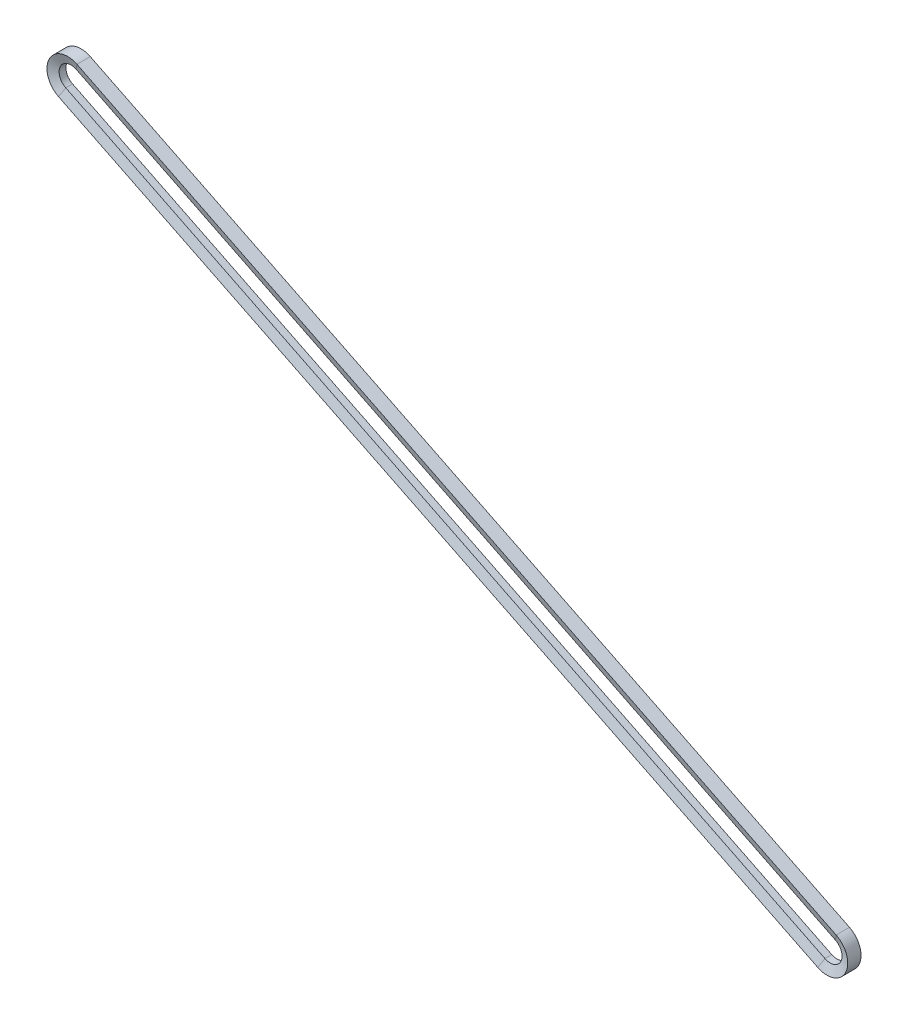
ISO-10303-21;
HEADER;
FILE_DESCRIPTION(('STEP AP214'),'2;1');
FILE_NAME('part.step','',(''),(''),'','','');
FILE_SCHEMA(('AUTOMOTIVE_DESIGN { 1 0 10303 214 1 1 1 1 }'));
ENDSEC;
DATA;
#1=APPLICATION_CONTEXT('core data for automotive mechanical design processes');
#2=APPLICATION_PROTOCOL_DEFINITION('international standard','automotive_design',2000,#1);
#3=PRODUCT_CONTEXT('',#1,'mechanical');
#4=PRODUCT('Part','Part','',(#3));
#5=PRODUCT_RELATED_PRODUCT_CATEGORY('part','',(#4));
#6=PRODUCT_DEFINITION_FORMATION('','',#4);
#7=PRODUCT_DEFINITION_CONTEXT('part definition',#1,'design');
#8=PRODUCT_DEFINITION('design','',#6,#7);
#9=PRODUCT_DEFINITION_SHAPE('','',#8);
#10=(LENGTH_UNIT() NAMED_UNIT(*) SI_UNIT(.MILLI.,.METRE.));
#11=(NAMED_UNIT(*) PLANE_ANGLE_UNIT() SI_UNIT($,.RADIAN.));
#12=(NAMED_UNIT(*) SI_UNIT($,.STERADIAN.) SOLID_ANGLE_UNIT());
#13=UNCERTAINTY_MEASURE_WITH_UNIT(LENGTH_MEASURE(1.E-05),#10,'distance_accuracy_value','');
#14=(GEOMETRIC_REPRESENTATION_CONTEXT(3) GLOBAL_UNCERTAINTY_ASSIGNED_CONTEXT((#13)) GLOBAL_UNIT_ASSIGNED_CONTEXT((#10,
#11,#12)) REPRESENTATION_CONTEXT('',''));
#15=CARTESIAN_POINT('',(0.,0.,0.));
#16=DIRECTION('',(0.,0.,1.));
#17=DIRECTION('',(1.,0.,0.));
#18=AXIS2_PLACEMENT_3D('',#15,#16,#17);
#19=CARTESIAN_POINT('',(342.117807064984,-162.821318820467,1.525));
#20=DIRECTION('',(-0.442324592710984,-0.896855035489606,0.));
#21=DIRECTION('',(0.896855035489606,-0.442324592710984,0.));
#22=AXIS2_PLACEMENT_3D('',#19,#20,#21);
#23=PLANE('',#22);
#24=DIRECTION('',(-0.896855035489606,0.442324592710984,0.));
#25=VECTOR('',#24,1.);
#26=CARTESIAN_POINT('',(342.117807064984,-162.821318820467,-1.525));
#27=LINE('',#26,#25);
#28=CARTESIAN_POINT('',(342.117807064984,-162.821318820467,-1.525));
#29=VERTEX_POINT('',#28);
#30=CARTESIAN_POINT('',(2.34432034136821,4.75333168809491,-1.525));
#31=VERTEX_POINT('',#30);
#32=EDGE_CURVE('E11',#29,#31,#27,.T.);
#33=ORIENTED_EDGE('',*,*,#32,.F.);
#34=DIRECTION('',(0.,0.,-1.));
#35=VECTOR('',#34,1.);
#36=CARTESIAN_POINT('',(342.117807064984,-162.821318820467,1.525));
#37=LINE('',#36,#35);
#38=CARTESIAN_POINT('',(342.117807064984,-162.821318820467,1.525));
#39=VERTEX_POINT('',#38);
#40=EDGE_CURVE('E42',#29,#39,#37,.F.);
#41=ORIENTED_EDGE('',*,*,#40,.T.);
#42=DIRECTION('',(-0.896855035489606,0.442324592710984,0.));
#43=VECTOR('',#42,1.);
#44=CARTESIAN_POINT('',(342.117807064984,-162.821318820467,1.525));
#45=LINE('',#44,#43);
#46=CARTESIAN_POINT('',(2.34432034136821,4.75333168809491,1.525));
#47=VERTEX_POINT('',#46);
#48=EDGE_CURVE('E127',#39,#47,#45,.T.);
#49=ORIENTED_EDGE('',*,*,#48,.T.);
#50=DIRECTION('',(0.,0.,-1.));
#51=VECTOR('',#50,1.);
#52=CARTESIAN_POINT('',(2.34432034136821,4.75333168809491,1.525));
#53=LINE('',#52,#51);
#54=EDGE_CURVE('E130',#31,#47,#53,.F.);
#55=ORIENTED_EDGE('',*,*,#54,.F.);
#56=EDGE_LOOP('',(#33,#41,#49,#55));
#57=FACE_BOUND('',#56,.T.);
#58=ADVANCED_FACE('F39',(#57),#23,.T.);
#59=CARTESIAN_POINT('',(342.117807064984,-162.821318820467,-1.525));
#60=DIRECTION('',(-0.151283920595477,-0.3067424877805,-0.93969262078591));
#61=DIRECTION('',(0.,0.950634084780424,-0.310314093868915));
#62=AXIS2_PLACEMENT_3D('',#59,#60,#61);
#63=PLANE('',#62);
#64=DIRECTION('',(-0.896855035489606,0.442324592710984,0.));
#65=VECTOR('',#64,1.);
#66=CARTESIAN_POINT('',(343.887105435828,-159.233898678508,-2.98088093706479));
#67=LINE('',#66,#65);
#68=CARTESIAN_POINT('',(343.887105435828,-159.233898678508,-2.98088093706479));
#69=VERTEX_POINT('',#68);
#70=CARTESIAN_POINT('',(4.11361871221214,8.34075183005334,-2.98088093706479));
#71=VERTEX_POINT('',#70);
#72=EDGE_CURVE('E47',#69,#71,#67,.T.);
#73=ORIENTED_EDGE('',*,*,#72,.F.);
#74=DIRECTION('',(0.415649155762644,0.842768058764268,-0.342020143325666));
#75=VECTOR('',#74,1.);
#76=CARTESIAN_POINT('',(342.117807064984,-162.821318820467,-1.525));
#77=LINE('',#76,#75);
#78=EDGE_CURVE('E197',#69,#29,#77,.F.);
#79=ORIENTED_EDGE('',*,*,#78,.T.);
#80=ORIENTED_EDGE('',*,*,#32,.T.);
#81=DIRECTION('',(0.415649155762644,0.842768058764268,-0.342020143325666));
#82=VECTOR('',#81,1.);
#83=CARTESIAN_POINT('',(2.34432034136821,4.75333168809491,-1.525));
#84=LINE('',#83,#82);
#85=EDGE_CURVE('E155',#71,#31,#84,.F.);
#86=ORIENTED_EDGE('',*,*,#85,.F.);
#87=EDGE_LOOP('',(#73,#79,#80,#86));
#88=FACE_BOUND('',#87,.T.);
#89=ADVANCED_FACE('F221',(#88),#63,.T.);
#90=CARTESIAN_POINT('',(343.887105435828,-159.233898678508,2.98088093706479));
#91=DIRECTION('',(0.442324592710984,0.896855035489606,0.));
#92=DIRECTION('',(-0.896855035489606,0.442324592710984,0.));
#93=AXIS2_PLACEMENT_3D('',#90,#91,#92);
#94=PLANE('',#93);
#95=DIRECTION('',(-0.896855035489606,0.442324592710984,0.));
#96=VECTOR('',#95,1.);
#97=CARTESIAN_POINT('',(343.887105435828,-159.233898678508,2.98088093706479));
#98=LINE('',#97,#96);
#99=CARTESIAN_POINT('',(343.887105435828,-159.233898678508,2.98088093706479));
#100=VERTEX_POINT('',#99);
#101=CARTESIAN_POINT('',(4.11361871221214,8.34075183005334,2.98088093706479));
#102=VERTEX_POINT('',#101);
#103=EDGE_CURVE('E136',#100,#102,#98,.T.);
#104=ORIENTED_EDGE('',*,*,#103,.F.);
#105=DIRECTION('',(0.,0.,-1.));
#106=VECTOR('',#105,1.);
#107=CARTESIAN_POINT('',(343.887105435828,-159.233898678508,2.98088093706479));
#108=LINE('',#107,#106);
#109=EDGE_CURVE('E181',#100,#69,#108,.T.);
#110=ORIENTED_EDGE('',*,*,#109,.T.);
#111=ORIENTED_EDGE('',*,*,#72,.T.);
#112=DIRECTION('',(0.,0.,-1.));
#113=VECTOR('',#112,1.);
#114=CARTESIAN_POINT('',(4.11361871221214,8.34075183005334,2.98088093706479));
#115=LINE('',#114,#113);
#116=EDGE_CURVE('E159',#102,#71,#115,.T.);
#117=ORIENTED_EDGE('',*,*,#116,.F.);
#118=EDGE_LOOP('',(#104,#110,#111,#117));
#119=FACE_BOUND('',#118,.T.);
#120=ADVANCED_FACE('F226',(#119),#94,.T.);
#121=CARTESIAN_POINT('',(339.773486723616,-167.574650508562,0.));
#122=DIRECTION('',(0.,0.,1.));
#123=DIRECTION('',(1.,0.,0.));
#124=AXIS2_PLACEMENT_3D('',#121,#122,#123);
#125=CYLINDRICAL_SURFACE('',#124,5.3000000000001);
#126=ORIENTED_EDGE('',*,*,#40,.F.);
#127=CARTESIAN_POINT('',(339.773486723616,-167.574650508562,-1.525));
#128=DIRECTION('',(0.,0.,1.));
#129=DIRECTION('',(-0.442324592710977,-0.896855035489609,0.));
#130=AXIS2_PLACEMENT_3D('',#127,#128,#129);
#131=CIRCLE('',#130,5.3000000000001);
#132=CARTESIAN_POINT('',(337.429166382248,-172.327982196657,-1.525));
#133=VERTEX_POINT('',#132);
#134=EDGE_CURVE('E83',#133,#29,#131,.T.);
#135=ORIENTED_EDGE('',*,*,#134,.F.);
#136=DIRECTION('',(0.,0.,-1.));
#137=VECTOR('',#136,1.);
#138=CARTESIAN_POINT('',(337.429166382248,-172.327982196657,1.525));
#139=LINE('',#138,#137);
#140=CARTESIAN_POINT('',(337.429166382248,-172.327982196657,1.525));
#141=VERTEX_POINT('',#140);
#142=EDGE_CURVE('E184',#133,#141,#139,.F.);
#143=ORIENTED_EDGE('',*,*,#142,.T.);
#144=CARTESIAN_POINT('',(339.773486723616,-167.574650508562,1.525));
#145=DIRECTION('',(0.,0.,1.));
#146=DIRECTION('',(-0.442324592710977,-0.896855035489609,0.));
#147=AXIS2_PLACEMENT_3D('',#144,#145,#146);
#148=CIRCLE('',#147,5.3000000000001);
#149=EDGE_CURVE('E179',#141,#39,#148,.T.);
#150=ORIENTED_EDGE('',*,*,#149,.T.);
#151=EDGE_LOOP('',(#126,#135,#143,#150));
#152=FACE_BOUND('',#151,.T.);
#153=ADVANCED_FACE('F210',(#152),#125,.F.);
#154=CARTESIAN_POINT('',(339.773486723616,-167.574650508562,-2.98088093706479));
#155=DIRECTION('',(0.,0.,-1.));
#156=DIRECTION('',(-1.,0.,0.));
#157=AXIS2_PLACEMENT_3D('',#154,#155,#156);
#158=CONICAL_SURFACE('',#157,9.30000000000011,1.22173047639603);
#159=ORIENTED_EDGE('',*,*,#134,.T.);
#160=ORIENTED_EDGE('',*,*,#78,.F.);
#161=CARTESIAN_POINT('',(339.773486723616,-167.574650508562,-2.98088093706479));
#162=DIRECTION('',(0.,0.,1.));
#163=DIRECTION('',(-0.44232459271098,-0.896855035489608,0.));
#164=AXIS2_PLACEMENT_3D('',#161,#162,#163);
#165=CIRCLE('',#164,9.30000000000011);
#166=CARTESIAN_POINT('',(335.659868011404,-175.915402338615,-2.98088093706479));
#167=VERTEX_POINT('',#166);
#168=EDGE_CURVE('E92',#167,#69,#165,.T.);
#169=ORIENTED_EDGE('',*,*,#168,.F.);
#170=DIRECTION('',(-0.415649155762643,-0.842768058764268,-0.342020143325666));
#171=VECTOR('',#170,1.);
#172=CARTESIAN_POINT('',(337.429166382248,-172.327982196657,-1.525));
#173=LINE('',#172,#171);
#174=EDGE_CURVE('E193',#167,#133,#173,.F.);
#175=ORIENTED_EDGE('',*,*,#174,.T.);
#176=EDGE_LOOP('',(#159,#160,#169,#175));
#177=FACE_BOUND('',#176,.T.);
#178=ADVANCED_FACE('F220',(#177),#158,.F.);
#179=CARTESIAN_POINT('',(339.773486723616,-167.574650508562,0.));
#180=DIRECTION('',(0.,0.,1.));
#181=DIRECTION('',(1.,0.,0.));
#182=AXIS2_PLACEMENT_3D('',#179,#180,#181);
#183=CYLINDRICAL_SURFACE('',#182,9.30000000000011);
#184=ORIENTED_EDGE('',*,*,#168,.T.);
#185=ORIENTED_EDGE('',*,*,#109,.F.);
#186=CARTESIAN_POINT('',(339.773486723616,-167.574650508562,2.98088093706479));
#187=DIRECTION('',(0.,0.,1.));
#188=DIRECTION('',(-0.44232459271098,-0.896855035489608,0.));
#189=AXIS2_PLACEMENT_3D('',#186,#187,#188);
#190=CIRCLE('',#189,9.30000000000011);
#191=CARTESIAN_POINT('',(335.659868011404,-175.915402338615,2.98088093706479));
#192=VERTEX_POINT('',#191);
#193=EDGE_CURVE('E100',#192,#100,#190,.T.);
#194=ORIENTED_EDGE('',*,*,#193,.F.);
#195=DIRECTION('',(0.,0.,-1.));
#196=VECTOR('',#195,1.);
#197=CARTESIAN_POINT('',(335.659868011404,-175.915402338615,2.98088093706479));
#198=LINE('',#197,#196);
#199=EDGE_CURVE('E173',#192,#167,#198,.T.);
#200=ORIENTED_EDGE('',*,*,#199,.T.);
#201=EDGE_LOOP('',(#184,#185,#194,#200));
#202=FACE_BOUND('',#201,.T.);
#203=ADVANCED_FACE('F227',(#202),#183,.T.);
#204=CARTESIAN_POINT('',(339.773486723616,-167.574650508562,1.525));
#205=DIRECTION('',(0.,0.,1.));
#206=DIRECTION('',(1.,0.,0.));
#207=AXIS2_PLACEMENT_3D('',#204,#205,#206);
#208=CONICAL_SURFACE('',#207,5.3000000000001,1.22173047639603);
#209=ORIENTED_EDGE('',*,*,#193,.T.);
#210=DIRECTION('',(0.415649155762644,0.842768058764268,0.342020143325666));
#211=VECTOR('',#210,1.);
#212=CARTESIAN_POINT('',(342.117807064984,-162.821318820467,1.525));
#213=LINE('',#212,#211);
#214=EDGE_CURVE('E177',#39,#100,#213,.T.);
#215=ORIENTED_EDGE('',*,*,#214,.F.);
#216=ORIENTED_EDGE('',*,*,#149,.F.);
#217=DIRECTION('',(-0.415649155762643,-0.842768058764268,0.342020143325666));
#218=VECTOR('',#217,1.);
#219=CARTESIAN_POINT('',(337.429166382248,-172.327982196657,1.525));
#220=LINE('',#219,#218);
#221=EDGE_CURVE('E168',#141,#192,#220,.T.);
#222=ORIENTED_EDGE('',*,*,#221,.T.);
#223=EDGE_LOOP('',(#209,#215,#216,#222));
#224=FACE_BOUND('',#223,.T.);
#225=ADVANCED_FACE('F228',(#224),#208,.F.);
#226=CARTESIAN_POINT('',(-2.34432034136821,-4.75333168809492,1.525));
#227=DIRECTION('',(0.442324592710984,0.896855035489606,0.));
#228=DIRECTION('',(-0.896855035489606,0.442324592710984,0.));
#229=AXIS2_PLACEMENT_3D('',#226,#227,#228);
#230=PLANE('',#229);
#231=ORIENTED_EDGE('',*,*,#142,.F.);
#232=DIRECTION('',(0.896855035489606,-0.442324592710984,0.));
#233=VECTOR('',#232,1.);
#234=CARTESIAN_POINT('',(-2.34432034136821,-4.75333168809492,-1.525));
#235=LINE('',#234,#233);
#236=CARTESIAN_POINT('',(-2.3443203413683,-4.75333168809509,-1.525));
#237=VERTEX_POINT('',#236);
#238=EDGE_CURVE('E203',#237,#133,#235,.T.);
#239=ORIENTED_EDGE('',*,*,#238,.F.);
#240=DIRECTION('',(0.,0.,-1.));
#241=VECTOR('',#240,1.);
#242=CARTESIAN_POINT('',(-2.34432034136821,-4.75333168809491,1.525));
#243=LINE('',#242,#241);
#244=CARTESIAN_POINT('',(-2.3443203413683,-4.75333168809509,1.525));
#245=VERTEX_POINT('',#244);
#246=EDGE_CURVE('E176',#237,#245,#243,.F.);
#247=ORIENTED_EDGE('',*,*,#246,.T.);
#248=DIRECTION('',(0.896855035489606,-0.442324592710984,0.));
#249=VECTOR('',#248,1.);
#250=CARTESIAN_POINT('',(-2.34432034136821,-4.75333168809492,1.525));
#251=LINE('',#250,#249);
#252=EDGE_CURVE('E171',#245,#141,#251,.T.);
#253=ORIENTED_EDGE('',*,*,#252,.T.);
#254=EDGE_LOOP('',(#231,#239,#247,#253));
#255=FACE_BOUND('',#254,.T.);
#256=ADVANCED_FACE('F215',(#255),#230,.T.);
#257=CARTESIAN_POINT('',(-2.34432034136821,-4.75333168809492,-1.525));
#258=DIRECTION('',(0.151283920595477,0.3067424877805,-0.93969262078591));
#259=DIRECTION('',(0.,0.950634084780424,0.310314093868915));
#260=AXIS2_PLACEMENT_3D('',#257,#258,#259);
#261=PLANE('',#260);
#262=ORIENTED_EDGE('',*,*,#238,.T.);
#263=ORIENTED_EDGE('',*,*,#174,.F.);
#264=DIRECTION('',(0.896855035489606,-0.442324592710984,0.));
#265=VECTOR('',#264,1.);
#266=CARTESIAN_POINT('',(-4.11361871221214,-8.34075183005334,-2.98088093706479));
#267=LINE('',#266,#265);
#268=CARTESIAN_POINT('',(-4.11361871221223,-8.34075183005352,-2.98088093706479));
#269=VERTEX_POINT('',#268);
#270=EDGE_CURVE('E112',#269,#167,#267,.T.);
#271=ORIENTED_EDGE('',*,*,#270,.F.);
#272=DIRECTION('',(-0.415649155762643,-0.842768058764268,-0.342020143325666));
#273=VECTOR('',#272,1.);
#274=CARTESIAN_POINT('',(-2.34432034136821,-4.75333168809491,-1.525));
#275=LINE('',#274,#273);
#276=EDGE_CURVE('E190',#269,#237,#275,.F.);
#277=ORIENTED_EDGE('',*,*,#276,.T.);
#278=EDGE_LOOP('',(#262,#263,#271,#277));
#279=FACE_BOUND('',#278,.T.);
#280=ADVANCED_FACE('F219',(#279),#261,.T.);
#281=CARTESIAN_POINT('',(-4.11361871221214,-8.34075183005334,2.98088093706479));
#282=DIRECTION('',(-0.442324592710984,-0.896855035489606,0.));
#283=DIRECTION('',(0.896855035489606,-0.442324592710984,0.));
#284=AXIS2_PLACEMENT_3D('',#281,#282,#283);
#285=PLANE('',#284);
#286=ORIENTED_EDGE('',*,*,#270,.T.);
#287=ORIENTED_EDGE('',*,*,#199,.F.);
#288=DIRECTION('',(0.896855035489606,-0.442324592710984,0.));
#289=VECTOR('',#288,1.);
#290=CARTESIAN_POINT('',(-4.11361871221214,-8.34075183005334,2.98088093706479));
#291=LINE('',#290,#289);
#292=CARTESIAN_POINT('',(-4.11361871221223,-8.34075183005352,2.98088093706479));
#293=VERTEX_POINT('',#292);
#294=EDGE_CURVE('E118',#293,#192,#291,.T.);
#295=ORIENTED_EDGE('',*,*,#294,.F.);
#296=DIRECTION('',(0.,0.,-1.));
#297=VECTOR('',#296,1.);
#298=CARTESIAN_POINT('',(-4.11361871221214,-8.34075183005334,2.98088093706479));
#299=LINE('',#298,#297);
#300=EDGE_CURVE('E166',#293,#269,#299,.T.);
#301=ORIENTED_EDGE('',*,*,#300,.T.);
#302=EDGE_LOOP('',(#286,#287,#295,#301));
#303=FACE_BOUND('',#302,.T.);
#304=ADVANCED_FACE('F284',(#303),#285,.T.);
#305=CARTESIAN_POINT('',(-2.34432034136821,-4.75333168809492,1.525));
#306=DIRECTION('',(0.151283920595477,0.3067424877805,0.93969262078591));
#307=DIRECTION('',(0.,-0.950634084780424,0.310314093868915));
#308=AXIS2_PLACEMENT_3D('',#305,#306,#307);
#309=PLANE('',#308);
#310=ORIENTED_EDGE('',*,*,#294,.T.);
#311=ORIENTED_EDGE('',*,*,#221,.F.);
#312=ORIENTED_EDGE('',*,*,#252,.F.);
#313=DIRECTION('',(-0.415649155762643,-0.842768058764268,0.342020143325666));
#314=VECTOR('',#313,1.);
#315=CARTESIAN_POINT('',(-2.34432034136821,-4.75333168809491,1.525));
#316=LINE('',#315,#314);
#317=EDGE_CURVE('E147',#245,#293,#316,.T.);
#318=ORIENTED_EDGE('',*,*,#317,.T.);
#319=EDGE_LOOP('',(#310,#311,#312,#318));
#320=FACE_BOUND('',#319,.T.);
#321=ADVANCED_FACE('F213',(#320),#309,.T.);
#322=CARTESIAN_POINT('',(0.,-1.11022302462516E-13,0.));
#323=DIRECTION('',(0.,0.,1.));
#324=DIRECTION('',(1.,0.,0.));
#325=AXIS2_PLACEMENT_3D('',#322,#323,#324);
#326=CYLINDRICAL_SURFACE('',#325,5.3000000000001);
#327=ORIENTED_EDGE('',*,*,#246,.F.);
#328=CARTESIAN_POINT('',(0.,-1.11022302462516E-13,-1.525));
#329=DIRECTION('',(0.,0.,1.));
#330=DIRECTION('',(0.442324592710975,0.89685503548961,0.));
#331=AXIS2_PLACEMENT_3D('',#328,#329,#330);
#332=CIRCLE('',#331,5.3000000000001);
#333=EDGE_CURVE('E154',#31,#237,#332,.T.);
#334=ORIENTED_EDGE('',*,*,#333,.F.);
#335=ORIENTED_EDGE('',*,*,#54,.T.);
#336=CARTESIAN_POINT('',(0.,-1.11022302462516E-13,1.525));
#337=DIRECTION('',(0.,0.,1.));
#338=DIRECTION('',(0.442324592710975,0.89685503548961,0.));
#339=AXIS2_PLACEMENT_3D('',#336,#337,#338);
#340=CIRCLE('',#339,5.3000000000001);
#341=EDGE_CURVE('E142',#47,#245,#340,.T.);
#342=ORIENTED_EDGE('',*,*,#341,.T.);
#343=EDGE_LOOP('',(#327,#334,#335,#342));
#344=FACE_BOUND('',#343,.T.);
#345=ADVANCED_FACE('F152',(#344),#326,.F.);
#346=CARTESIAN_POINT('',(0.,-1.11022302462516E-13,-2.98088093706479));
#347=DIRECTION('',(0.,0.,-1.));
#348=DIRECTION('',(-1.,0.,0.));
#349=AXIS2_PLACEMENT_3D('',#346,#347,#348);
#350=CONICAL_SURFACE('',#349,9.3000000000001,1.22173047639603);
#351=ORIENTED_EDGE('',*,*,#333,.T.);
#352=ORIENTED_EDGE('',*,*,#276,.F.);
#353=CARTESIAN_POINT('',(0.,-1.11022302462516E-13,-2.98088093706479));
#354=DIRECTION('',(0.,0.,1.));
#355=DIRECTION('',(0.442324592710978,0.896855035489609,0.));
#356=AXIS2_PLACEMENT_3D('',#353,#354,#355);
#357=CIRCLE('',#356,9.3000000000001);
#358=EDGE_CURVE('E187',#71,#269,#357,.T.);
#359=ORIENTED_EDGE('',*,*,#358,.F.);
#360=ORIENTED_EDGE('',*,*,#85,.T.);
#361=EDGE_LOOP('',(#351,#352,#359,#360));
#362=FACE_BOUND('',#361,.T.);
#363=ADVANCED_FACE('F217',(#362),#350,.F.);
#364=CARTESIAN_POINT('',(0.,-1.11022302462516E-13,0.));
#365=DIRECTION('',(0.,0.,1.));
#366=DIRECTION('',(1.,0.,0.));
#367=AXIS2_PLACEMENT_3D('',#364,#365,#366);
#368=CYLINDRICAL_SURFACE('',#367,9.3000000000001);
#369=ORIENTED_EDGE('',*,*,#358,.T.);
#370=ORIENTED_EDGE('',*,*,#300,.F.);
#371=CARTESIAN_POINT('',(0.,-1.11022302462516E-13,2.98088093706479));
#372=DIRECTION('',(0.,0.,1.));
#373=DIRECTION('',(0.442324592710978,0.896855035489609,0.));
#374=AXIS2_PLACEMENT_3D('',#371,#372,#373);
#375=CIRCLE('',#374,9.3000000000001);
#376=EDGE_CURVE('E165',#102,#293,#375,.T.);
#377=ORIENTED_EDGE('',*,*,#376,.F.);
#378=ORIENTED_EDGE('',*,*,#116,.T.);
#379=EDGE_LOOP('',(#369,#370,#377,#378));
#380=FACE_BOUND('',#379,.T.);
#381=ADVANCED_FACE('F224',(#380),#368,.T.);
#382=CARTESIAN_POINT('',(0.,-1.11022302462516E-13,1.525));
#383=DIRECTION('',(0.,0.,1.));
#384=DIRECTION('',(1.,0.,0.));
#385=AXIS2_PLACEMENT_3D('',#382,#383,#384);
#386=CONICAL_SURFACE('',#385,5.3000000000001,1.22173047639603);
#387=ORIENTED_EDGE('',*,*,#376,.T.);
#388=ORIENTED_EDGE('',*,*,#317,.F.);
#389=ORIENTED_EDGE('',*,*,#341,.F.);
#390=DIRECTION('',(0.415649155762644,0.842768058764268,0.342020143325666));
#391=VECTOR('',#390,1.);
#392=CARTESIAN_POINT('',(2.34432034136821,4.75333168809491,1.525));
#393=LINE('',#392,#391);
#394=EDGE_CURVE('E145',#47,#102,#393,.T.);
#395=ORIENTED_EDGE('',*,*,#394,.T.);
#396=EDGE_LOOP('',(#387,#388,#389,#395));
#397=FACE_BOUND('',#396,.T.);
#398=ADVANCED_FACE('F144',(#397),#386,.F.);
#399=CARTESIAN_POINT('',(342.117807064984,-162.821318820467,1.525));
#400=DIRECTION('',(-0.151283920595477,-0.3067424877805,0.93969262078591));
#401=DIRECTION('',(0.,-0.950634084780424,-0.310314093868915));
#402=AXIS2_PLACEMENT_3D('',#399,#400,#401);
#403=PLANE('',#402);
#404=ORIENTED_EDGE('',*,*,#214,.T.);
#405=ORIENTED_EDGE('',*,*,#103,.T.);
#406=ORIENTED_EDGE('',*,*,#394,.F.);
#407=ORIENTED_EDGE('',*,*,#48,.F.);
#408=EDGE_LOOP('',(#404,#405,#406,#407));
#409=FACE_BOUND('',#408,.T.);
#410=ADVANCED_FACE('F157',(#409),#403,.T.);
#411=CLOSED_SHELL('',(#58,#89,#120,#153,#178,#203,#225,#256,#280,#304,#321,#345,#363,#381,#398,#410));
#412=MANIFOLD_SOLID_BREP('B2',#411);
#413=ADVANCED_BREP_SHAPE_REPRESENTATION('',(#18,#412),#14);
#414=SHAPE_DEFINITION_REPRESENTATION(#9,#413);
ENDSEC;
END-ISO-10303-21;
